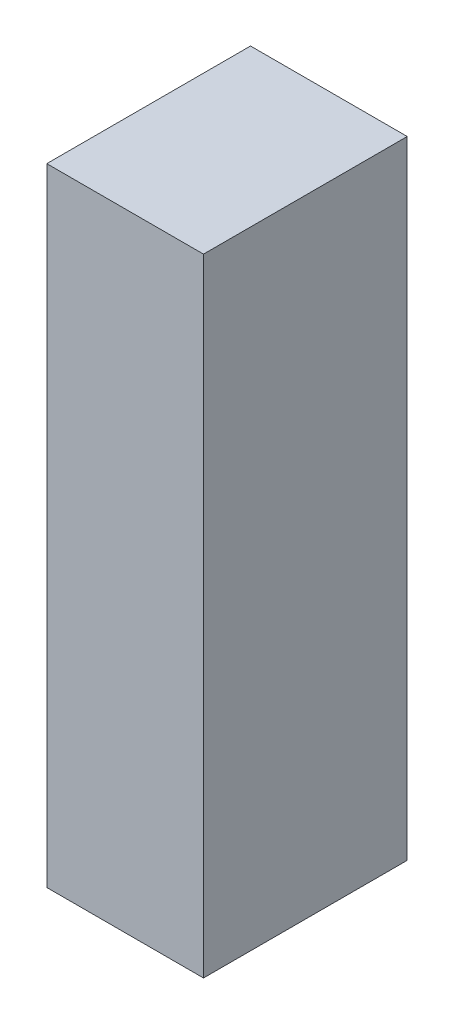
ISO-10303-21;
HEADER;
FILE_DESCRIPTION(('STEP AP214'),'2;1');
FILE_NAME('part.step','',(''),(''),'','','');
FILE_SCHEMA(('AUTOMOTIVE_DESIGN { 1 0 10303 214 1 1 1 1 }'));
ENDSEC;
DATA;
#1=APPLICATION_CONTEXT('core data for automotive mechanical design processes');
#2=APPLICATION_PROTOCOL_DEFINITION('international standard','automotive_design',2000,#1);
#3=PRODUCT_CONTEXT('',#1,'mechanical');
#4=PRODUCT('Part','Part','',(#3));
#5=PRODUCT_RELATED_PRODUCT_CATEGORY('part','',(#4));
#6=PRODUCT_DEFINITION_FORMATION('','',#4);
#7=PRODUCT_DEFINITION_CONTEXT('part definition',#1,'design');
#8=PRODUCT_DEFINITION('design','',#6,#7);
#9=PRODUCT_DEFINITION_SHAPE('','',#8);
#10=(LENGTH_UNIT() NAMED_UNIT(*) SI_UNIT(.MILLI.,.METRE.));
#11=(NAMED_UNIT(*) PLANE_ANGLE_UNIT() SI_UNIT($,.RADIAN.));
#12=(NAMED_UNIT(*) SI_UNIT($,.STERADIAN.) SOLID_ANGLE_UNIT());
#13=UNCERTAINTY_MEASURE_WITH_UNIT(LENGTH_MEASURE(1.E-05),#10,'distance_accuracy_value','');
#14=(GEOMETRIC_REPRESENTATION_CONTEXT(3) GLOBAL_UNCERTAINTY_ASSIGNED_CONTEXT((#13)) GLOBAL_UNIT_ASSIGNED_CONTEXT((#10,
#11,#12)) REPRESENTATION_CONTEXT('',''));
#15=CARTESIAN_POINT('',(0.,0.,0.));
#16=DIRECTION('',(0.,0.,1.));
#17=DIRECTION('',(1.,0.,0.));
#18=AXIS2_PLACEMENT_3D('',#15,#16,#17);
#19=CARTESIAN_POINT('',(2.5,20.,-3.25));
#20=DIRECTION('',(-1.,0.,0.));
#21=DIRECTION('',(0.,0.,1.));
#22=AXIS2_PLACEMENT_3D('',#19,#20,#21);
#23=PLANE('',#22);
#24=DIRECTION('',(0.,0.,-1.));
#25=VECTOR('',#24,1.);
#26=CARTESIAN_POINT('',(2.5,0.,-3.25));
#27=LINE('',#26,#25);
#28=CARTESIAN_POINT('',(2.5,0.,3.25));
#29=VERTEX_POINT('',#28);
#30=CARTESIAN_POINT('',(2.5,0.,-3.25));
#31=VERTEX_POINT('',#30);
#32=EDGE_CURVE('E113',#29,#31,#27,.T.);
#33=ORIENTED_EDGE('',*,*,#32,.T.);
#34=DIRECTION('',(0.,-1.,0.));
#35=VECTOR('',#34,1.);
#36=CARTESIAN_POINT('',(2.5,20.,-3.25));
#37=LINE('',#36,#35);
#38=CARTESIAN_POINT('',(2.5,20.,-3.25));
#39=VERTEX_POINT('',#38);
#40=EDGE_CURVE('E11',#39,#31,#37,.T.);
#41=ORIENTED_EDGE('',*,*,#40,.F.);
#42=DIRECTION('',(0.,0.,-1.));
#43=VECTOR('',#42,1.);
#44=CARTESIAN_POINT('',(2.5,20.,-3.25));
#45=LINE('',#44,#43);
#46=CARTESIAN_POINT('',(2.5,20.,3.25));
#47=VERTEX_POINT('',#46);
#48=EDGE_CURVE('E97',#47,#39,#45,.T.);
#49=ORIENTED_EDGE('',*,*,#48,.F.);
#50=DIRECTION('',(0.,-1.,0.));
#51=VECTOR('',#50,1.);
#52=CARTESIAN_POINT('',(2.5,20.,3.25));
#53=LINE('',#52,#51);
#54=EDGE_CURVE('E109',#47,#29,#53,.T.);
#55=ORIENTED_EDGE('',*,*,#54,.T.);
#56=EDGE_LOOP('',(#33,#41,#49,#55));
#57=FACE_BOUND('',#56,.T.);
#58=ADVANCED_FACE('F45',(#57),#23,.F.);
#59=CARTESIAN_POINT('',(-2.5,20.,-3.25));
#60=DIRECTION('',(0.,0.,1.));
#61=DIRECTION('',(1.,0.,0.));
#62=AXIS2_PLACEMENT_3D('',#59,#60,#61);
#63=PLANE('',#62);
#64=DIRECTION('',(-1.,0.,0.));
#65=VECTOR('',#64,1.);
#66=CARTESIAN_POINT('',(-2.5,0.,-3.25));
#67=LINE('',#66,#65);
#68=CARTESIAN_POINT('',(-2.5,0.,-3.25));
#69=VERTEX_POINT('',#68);
#70=EDGE_CURVE('E102',#31,#69,#67,.T.);
#71=ORIENTED_EDGE('',*,*,#70,.T.);
#72=DIRECTION('',(0.,-1.,0.));
#73=VECTOR('',#72,1.);
#74=CARTESIAN_POINT('',(-2.5,20.,-3.25));
#75=LINE('',#74,#73);
#76=CARTESIAN_POINT('',(-2.5,20.,-3.25));
#77=VERTEX_POINT('',#76);
#78=EDGE_CURVE('E54',#77,#69,#75,.T.);
#79=ORIENTED_EDGE('',*,*,#78,.F.);
#80=DIRECTION('',(-1.,0.,0.));
#81=VECTOR('',#80,1.);
#82=CARTESIAN_POINT('',(-2.5,20.,-3.25));
#83=LINE('',#82,#81);
#84=EDGE_CURVE('E92',#39,#77,#83,.T.);
#85=ORIENTED_EDGE('',*,*,#84,.F.);
#86=ORIENTED_EDGE('',*,*,#40,.T.);
#87=EDGE_LOOP('',(#71,#79,#85,#86));
#88=FACE_BOUND('',#87,.T.);
#89=ADVANCED_FACE('F101',(#88),#63,.F.);
#90=CARTESIAN_POINT('',(-2.5,20.,-3.25));
#91=DIRECTION('',(1.,0.,0.));
#92=DIRECTION('',(0.,0.,-1.));
#93=AXIS2_PLACEMENT_3D('',#90,#91,#92);
#94=PLANE('',#93);
#95=DIRECTION('',(0.,0.,1.));
#96=VECTOR('',#95,1.);
#97=CARTESIAN_POINT('',(-2.5,0.,-3.25));
#98=LINE('',#97,#96);
#99=CARTESIAN_POINT('',(-2.5,0.,3.25));
#100=VERTEX_POINT('',#99);
#101=EDGE_CURVE('E79',#69,#100,#98,.T.);
#102=ORIENTED_EDGE('',*,*,#101,.T.);
#103=DIRECTION('',(0.,-1.,0.));
#104=VECTOR('',#103,1.);
#105=CARTESIAN_POINT('',(-2.5,20.,3.25));
#106=LINE('',#105,#104);
#107=CARTESIAN_POINT('',(-2.5,20.,3.25));
#108=VERTEX_POINT('',#107);
#109=EDGE_CURVE('E104',#108,#100,#106,.T.);
#110=ORIENTED_EDGE('',*,*,#109,.F.);
#111=DIRECTION('',(0.,0.,1.));
#112=VECTOR('',#111,1.);
#113=CARTESIAN_POINT('',(-2.5,20.,-3.25));
#114=LINE('',#113,#112);
#115=EDGE_CURVE('E95',#77,#108,#114,.T.);
#116=ORIENTED_EDGE('',*,*,#115,.F.);
#117=ORIENTED_EDGE('',*,*,#78,.T.);
#118=EDGE_LOOP('',(#102,#110,#116,#117));
#119=FACE_BOUND('',#118,.T.);
#120=ADVANCED_FACE('F105',(#119),#94,.F.);
#121=CARTESIAN_POINT('',(-2.5,20.,3.25));
#122=DIRECTION('',(0.,0.,-1.));
#123=DIRECTION('',(-1.,0.,0.));
#124=AXIS2_PLACEMENT_3D('',#121,#122,#123);
#125=PLANE('',#124);
#126=DIRECTION('',(1.,0.,0.));
#127=VECTOR('',#126,1.);
#128=CARTESIAN_POINT('',(-2.5,0.,3.25));
#129=LINE('',#128,#127);
#130=EDGE_CURVE('E85',#100,#29,#129,.T.);
#131=ORIENTED_EDGE('',*,*,#130,.T.);
#132=ORIENTED_EDGE('',*,*,#54,.F.);
#133=DIRECTION('',(1.,0.,0.));
#134=VECTOR('',#133,1.);
#135=CARTESIAN_POINT('',(-2.5,20.,3.25));
#136=LINE('',#135,#134);
#137=EDGE_CURVE('E62',#108,#47,#136,.T.);
#138=ORIENTED_EDGE('',*,*,#137,.F.);
#139=ORIENTED_EDGE('',*,*,#109,.T.);
#140=EDGE_LOOP('',(#131,#132,#138,#139));
#141=FACE_BOUND('',#140,.T.);
#142=ADVANCED_FACE('F126',(#141),#125,.F.);
#143=CARTESIAN_POINT('',(0.,20.,0.));
#144=DIRECTION('',(0.,1.,0.));
#145=DIRECTION('',(0.,0.,1.));
#146=AXIS2_PLACEMENT_3D('',#143,#144,#145);
#147=PLANE('',#146);
#148=ORIENTED_EDGE('',*,*,#48,.T.);
#149=ORIENTED_EDGE('',*,*,#84,.T.);
#150=ORIENTED_EDGE('',*,*,#115,.T.);
#151=ORIENTED_EDGE('',*,*,#137,.T.);
#152=EDGE_LOOP('',(#148,#149,#150,#151));
#153=FACE_BOUND('',#152,.T.);
#154=ADVANCED_FACE('F93',(#153),#147,.T.);
#155=CARTESIAN_POINT('',(0.,0.,0.));
#156=DIRECTION('',(0.,1.,0.));
#157=DIRECTION('',(0.,0.,1.));
#158=AXIS2_PLACEMENT_3D('',#155,#156,#157);
#159=PLANE('',#158);
#160=ORIENTED_EDGE('',*,*,#32,.F.);
#161=ORIENTED_EDGE('',*,*,#130,.F.);
#162=ORIENTED_EDGE('',*,*,#101,.F.);
#163=ORIENTED_EDGE('',*,*,#70,.F.);
#164=EDGE_LOOP('',(#160,#161,#162,#163));
#165=FACE_BOUND('',#164,.T.);
#166=ADVANCED_FACE('F129',(#165),#159,.F.);
#167=CLOSED_SHELL('',(#58,#89,#120,#142,#154,#166));
#168=MANIFOLD_SOLID_BREP('B2',#167);
#169=ADVANCED_BREP_SHAPE_REPRESENTATION('',(#18,#168),#14);
#170=SHAPE_DEFINITION_REPRESENTATION(#9,#169);
ENDSEC;
END-ISO-10303-21;
